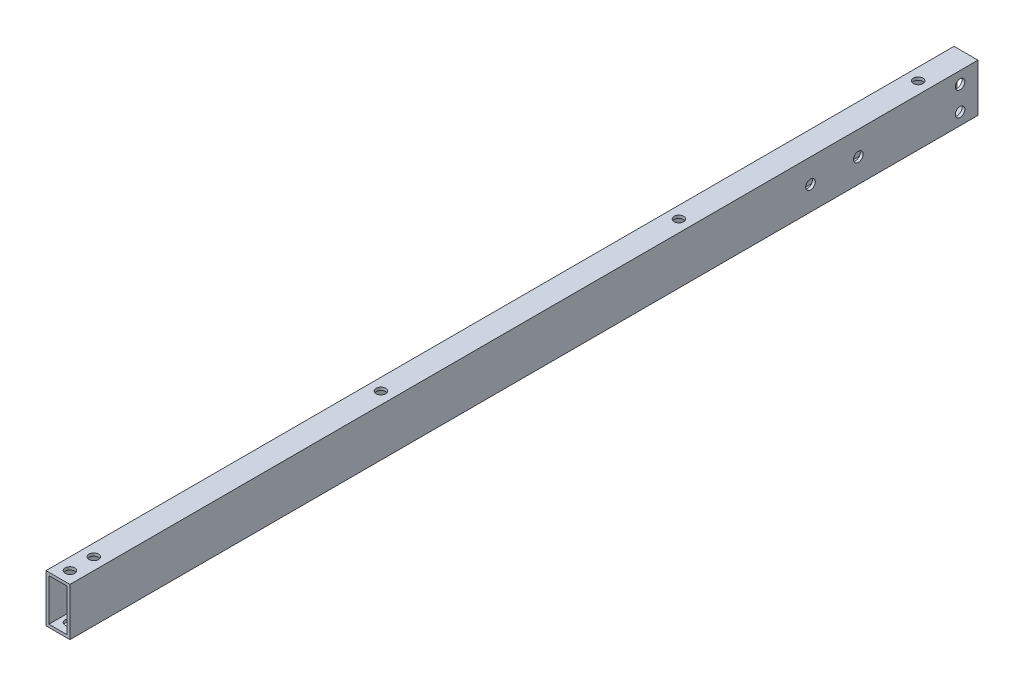
ISO-10303-21;
HEADER;
FILE_DESCRIPTION(('STEP AP214'),'2;1');
FILE_NAME('part.step','',(''),(''),'','','');
FILE_SCHEMA(('AUTOMOTIVE_DESIGN { 1 0 10303 214 1 1 1 1 }'));
ENDSEC;
DATA;
#1=APPLICATION_CONTEXT('core data for automotive mechanical design processes');
#2=APPLICATION_PROTOCOL_DEFINITION('international standard','automotive_design',2000,#1);
#3=PRODUCT_CONTEXT('',#1,'mechanical');
#4=PRODUCT('Part','Part','',(#3));
#5=PRODUCT_RELATED_PRODUCT_CATEGORY('part','',(#4));
#6=PRODUCT_DEFINITION_FORMATION('','',#4);
#7=PRODUCT_DEFINITION_CONTEXT('part definition',#1,'design');
#8=PRODUCT_DEFINITION('design','',#6,#7);
#9=PRODUCT_DEFINITION_SHAPE('','',#8);
#10=(LENGTH_UNIT() NAMED_UNIT(*) SI_UNIT(.MILLI.,.METRE.));
#11=(NAMED_UNIT(*) PLANE_ANGLE_UNIT() SI_UNIT($,.RADIAN.));
#12=(NAMED_UNIT(*) SI_UNIT($,.STERADIAN.) SOLID_ANGLE_UNIT());
#13=UNCERTAINTY_MEASURE_WITH_UNIT(LENGTH_MEASURE(1.E-05),#10,'distance_accuracy_value','');
#14=(GEOMETRIC_REPRESENTATION_CONTEXT(3) GLOBAL_UNCERTAINTY_ASSIGNED_CONTEXT((#13)) GLOBAL_UNIT_ASSIGNED_CONTEXT((#10,
#11,#12)) REPRESENTATION_CONTEXT('',''));
#15=CARTESIAN_POINT('',(0.,0.,0.));
#16=DIRECTION('',(0.,0.,1.));
#17=DIRECTION('',(1.,0.,0.));
#18=AXIS2_PLACEMENT_3D('',#15,#16,#17);
#19=CARTESIAN_POINT('',(0.,0.,379.5));
#20=DIRECTION('',(0.,0.,1.));
#21=DIRECTION('',(1.,0.,0.));
#22=AXIS2_PLACEMENT_3D('',#19,#20,#21);
#23=PLANE('',#22);
#24=DIRECTION('',(0.,1.,0.));
#25=VECTOR('',#24,1.);
#26=CARTESIAN_POINT('',(5.,9.99999999999999,379.5));
#27=LINE('',#26,#25);
#28=CARTESIAN_POINT('',(5.,-10.,379.5));
#29=VERTEX_POINT('',#28);
#30=CARTESIAN_POINT('',(5.,9.99999999999999,379.5));
#31=VERTEX_POINT('',#30);
#32=EDGE_CURVE('E181',#29,#31,#27,.T.);
#33=ORIENTED_EDGE('',*,*,#32,.T.);
#34=DIRECTION('',(-1.,0.,0.));
#35=VECTOR('',#34,1.);
#36=CARTESIAN_POINT('',(-5.,9.99999999999999,379.5));
#37=LINE('',#36,#35);
#38=CARTESIAN_POINT('',(-5.,9.99999999999999,379.5));
#39=VERTEX_POINT('',#38);
#40=EDGE_CURVE('E185',#31,#39,#37,.T.);
#41=ORIENTED_EDGE('',*,*,#40,.T.);
#42=DIRECTION('',(0.,-1.,0.));
#43=VECTOR('',#42,1.);
#44=CARTESIAN_POINT('',(-5.,9.99999999999999,379.5));
#45=LINE('',#44,#43);
#46=CARTESIAN_POINT('',(-5.,-10.,379.5));
#47=VERTEX_POINT('',#46);
#48=EDGE_CURVE('E189',#39,#47,#45,.T.);
#49=ORIENTED_EDGE('',*,*,#48,.T.);
#50=DIRECTION('',(1.,0.,0.));
#51=VECTOR('',#50,1.);
#52=CARTESIAN_POINT('',(-5.,-10.,379.5));
#53=LINE('',#52,#51);
#54=EDGE_CURVE('E192',#47,#29,#53,.T.);
#55=ORIENTED_EDGE('',*,*,#54,.T.);
#56=EDGE_LOOP('',(#33,#41,#49,#55));
#57=FACE_BOUND('',#56,.T.);
#58=DIRECTION('',(-1.,0.,0.));
#59=VECTOR('',#58,1.);
#60=CARTESIAN_POINT('',(-5.,8.79999999999999,379.5));
#61=LINE('',#60,#59);
#62=CARTESIAN_POINT('',(3.8,8.79999999999999,379.5));
#63=VERTEX_POINT('',#62);
#64=CARTESIAN_POINT('',(-3.8,8.79999999999999,379.5));
#65=VERTEX_POINT('',#64);
#66=EDGE_CURVE('E140',#63,#65,#61,.T.);
#67=ORIENTED_EDGE('',*,*,#66,.F.);
#68=DIRECTION('',(0.,1.,0.));
#69=VECTOR('',#68,1.);
#70=CARTESIAN_POINT('',(3.8,9.99999999999999,379.5));
#71=LINE('',#70,#69);
#72=CARTESIAN_POINT('',(3.8,-8.80000000000001,379.5));
#73=VERTEX_POINT('',#72);
#74=EDGE_CURVE('E131',#73,#63,#71,.T.);
#75=ORIENTED_EDGE('',*,*,#74,.F.);
#76=DIRECTION('',(1.,0.,0.));
#77=VECTOR('',#76,1.);
#78=CARTESIAN_POINT('',(-5.,-8.80000000000001,379.5));
#79=LINE('',#78,#77);
#80=CARTESIAN_POINT('',(-3.8,-8.80000000000001,379.5));
#81=VERTEX_POINT('',#80);
#82=EDGE_CURVE('E157',#81,#73,#79,.T.);
#83=ORIENTED_EDGE('',*,*,#82,.F.);
#84=DIRECTION('',(0.,-1.,0.));
#85=VECTOR('',#84,1.);
#86=CARTESIAN_POINT('',(-3.8,9.99999999999999,379.5));
#87=LINE('',#86,#85);
#88=EDGE_CURVE('E153',#65,#81,#87,.T.);
#89=ORIENTED_EDGE('',*,*,#88,.F.);
#90=EDGE_LOOP('',(#67,#75,#83,#89));
#91=FACE_BOUND('',#90,.T.);
#92=ADVANCED_FACE('F63',(#57,#91),#23,.T.);
#93=CARTESIAN_POINT('',(0.,0.,0.));
#94=DIRECTION('',(0.,0.,1.));
#95=DIRECTION('',(1.,0.,0.));
#96=AXIS2_PLACEMENT_3D('',#93,#94,#95);
#97=PLANE('',#96);
#98=DIRECTION('',(0.,1.,0.));
#99=VECTOR('',#98,1.);
#100=CARTESIAN_POINT('',(5.,9.99999999999999,0.));
#101=LINE('',#100,#99);
#102=CARTESIAN_POINT('',(5.,-10.,0.));
#103=VERTEX_POINT('',#102);
#104=CARTESIAN_POINT('',(5.,9.99999999999999,0.));
#105=VERTEX_POINT('',#104);
#106=EDGE_CURVE('E149',#103,#105,#101,.T.);
#107=ORIENTED_EDGE('',*,*,#106,.F.);
#108=DIRECTION('',(1.,0.,0.));
#109=VECTOR('',#108,1.);
#110=CARTESIAN_POINT('',(-5.,-10.,0.));
#111=LINE('',#110,#109);
#112=CARTESIAN_POINT('',(-5.,-10.,0.));
#113=VERTEX_POINT('',#112);
#114=EDGE_CURVE('E186',#113,#103,#111,.T.);
#115=ORIENTED_EDGE('',*,*,#114,.F.);
#116=DIRECTION('',(0.,-1.,0.));
#117=VECTOR('',#116,1.);
#118=CARTESIAN_POINT('',(-5.,9.99999999999999,0.));
#119=LINE('',#118,#117);
#120=CARTESIAN_POINT('',(-5.,9.99999999999999,0.));
#121=VERTEX_POINT('',#120);
#122=EDGE_CURVE('E202',#121,#113,#119,.T.);
#123=ORIENTED_EDGE('',*,*,#122,.F.);
#124=DIRECTION('',(-1.,0.,0.));
#125=VECTOR('',#124,1.);
#126=CARTESIAN_POINT('',(-5.,9.99999999999999,0.));
#127=LINE('',#126,#125);
#128=EDGE_CURVE('E199',#105,#121,#127,.T.);
#129=ORIENTED_EDGE('',*,*,#128,.F.);
#130=EDGE_LOOP('',(#107,#115,#123,#129));
#131=FACE_BOUND('',#130,.T.);
#132=DIRECTION('',(0.,1.,0.));
#133=VECTOR('',#132,1.);
#134=CARTESIAN_POINT('',(3.8,9.99999999999999,0.));
#135=LINE('',#134,#133);
#136=CARTESIAN_POINT('',(3.8,-8.80000000000001,0.));
#137=VERTEX_POINT('',#136);
#138=CARTESIAN_POINT('',(3.8,8.79999999999999,0.));
#139=VERTEX_POINT('',#138);
#140=EDGE_CURVE('E89',#137,#139,#135,.T.);
#141=ORIENTED_EDGE('',*,*,#140,.T.);
#142=DIRECTION('',(-1.,0.,0.));
#143=VECTOR('',#142,1.);
#144=CARTESIAN_POINT('',(-5.,8.79999999999999,0.));
#145=LINE('',#144,#143);
#146=CARTESIAN_POINT('',(-3.8,8.79999999999999,0.));
#147=VERTEX_POINT('',#146);
#148=EDGE_CURVE('E147',#139,#147,#145,.T.);
#149=ORIENTED_EDGE('',*,*,#148,.T.);
#150=DIRECTION('',(0.,-1.,0.));
#151=VECTOR('',#150,1.);
#152=CARTESIAN_POINT('',(-3.8,9.99999999999999,0.));
#153=LINE('',#152,#151);
#154=CARTESIAN_POINT('',(-3.8,-8.80000000000001,0.));
#155=VERTEX_POINT('',#154);
#156=EDGE_CURVE('E168',#147,#155,#153,.T.);
#157=ORIENTED_EDGE('',*,*,#156,.T.);
#158=DIRECTION('',(1.,0.,0.));
#159=VECTOR('',#158,1.);
#160=CARTESIAN_POINT('',(-5.,-8.80000000000001,0.));
#161=LINE('',#160,#159);
#162=EDGE_CURVE('E141',#155,#137,#161,.T.);
#163=ORIENTED_EDGE('',*,*,#162,.T.);
#164=EDGE_LOOP('',(#141,#149,#157,#163));
#165=FACE_BOUND('',#164,.T.);
#166=ADVANCED_FACE('F365',(#131,#165),#97,.F.);
#167=CARTESIAN_POINT('',(5.,9.99999999999999,379.5));
#168=DIRECTION('',(-1.,0.,0.));
#169=DIRECTION('',(0.,-1.,0.));
#170=AXIS2_PLACEMENT_3D('',#167,#168,#169);
#171=PLANE('',#170);
#172=CARTESIAN_POINT('',(5.,0.,70.));
#173=DIRECTION('',(1.,0.,0.));
#174=DIRECTION('',(0.,1.,0.));
#175=AXIS2_PLACEMENT_3D('',#172,#173,#174);
#176=CIRCLE('',#175,2.);
#177=CARTESIAN_POINT('',(5.,1.99999999999999,70.));
#178=VERTEX_POINT('',#177);
#179=EDGE_CURVE('E422',#178,#178,#176,.T.);
#180=ORIENTED_EDGE('',*,*,#179,.F.);
#181=EDGE_LOOP('',(#180));
#182=FACE_BOUND('',#181,.T.);
#183=CARTESIAN_POINT('',(5.,0.,50.));
#184=DIRECTION('',(1.,0.,0.));
#185=DIRECTION('',(0.,1.,0.));
#186=AXIS2_PLACEMENT_3D('',#183,#184,#185);
#187=CIRCLE('',#186,2.);
#188=CARTESIAN_POINT('',(5.,2.,50.));
#189=VERTEX_POINT('',#188);
#190=EDGE_CURVE('E416',#189,#189,#187,.T.);
#191=ORIENTED_EDGE('',*,*,#190,.F.);
#192=EDGE_LOOP('',(#191));
#193=FACE_BOUND('',#192,.T.);
#194=CARTESIAN_POINT('',(5.,5.,7.5));
#195=DIRECTION('',(1.,0.,0.));
#196=DIRECTION('',(0.,1.,0.));
#197=AXIS2_PLACEMENT_3D('',#194,#195,#196);
#198=CIRCLE('',#197,2.);
#199=CARTESIAN_POINT('',(5.,7.,7.5));
#200=VERTEX_POINT('',#199);
#201=EDGE_CURVE('E405',#200,#200,#198,.T.);
#202=ORIENTED_EDGE('',*,*,#201,.F.);
#203=EDGE_LOOP('',(#202));
#204=FACE_BOUND('',#203,.T.);
#205=CARTESIAN_POINT('',(5.,-5.,7.5));
#206=DIRECTION('',(1.,0.,0.));
#207=DIRECTION('',(0.,-1.,0.));
#208=AXIS2_PLACEMENT_3D('',#205,#206,#207);
#209=CIRCLE('',#208,2.);
#210=CARTESIAN_POINT('',(5.,-7.,7.5));
#211=VERTEX_POINT('',#210);
#212=EDGE_CURVE('E406',#211,#211,#209,.T.);
#213=ORIENTED_EDGE('',*,*,#212,.F.);
#214=EDGE_LOOP('',(#213));
#215=FACE_BOUND('',#214,.T.);
#216=ORIENTED_EDGE('',*,*,#106,.T.);
#217=DIRECTION('',(0.,0.,-1.));
#218=VECTOR('',#217,1.);
#219=CARTESIAN_POINT('',(5.,9.99999999999999,379.5));
#220=LINE('',#219,#218);
#221=EDGE_CURVE('E12',#31,#105,#220,.T.);
#222=ORIENTED_EDGE('',*,*,#221,.F.);
#223=ORIENTED_EDGE('',*,*,#32,.F.);
#224=DIRECTION('',(0.,0.,-1.));
#225=VECTOR('',#224,1.);
#226=CARTESIAN_POINT('',(5.,-10.,379.5));
#227=LINE('',#226,#225);
#228=EDGE_CURVE('E195',#29,#103,#227,.T.);
#229=ORIENTED_EDGE('',*,*,#228,.T.);
#230=EDGE_LOOP('',(#216,#222,#223,#229));
#231=FACE_BOUND('',#230,.T.);
#232=ADVANCED_FACE('F65',(#182,#193,#204,#215,#231),#171,.F.);
#233=CARTESIAN_POINT('',(-5.,9.99999999999999,379.5));
#234=DIRECTION('',(0.,-1.,0.));
#235=DIRECTION('',(0.,0.,-1.));
#236=AXIS2_PLACEMENT_3D('',#233,#234,#235);
#237=PLANE('',#236);
#238=CARTESIAN_POINT('',(0.,9.99999999999999,20.));
#239=DIRECTION('',(0.,1.,0.));
#240=DIRECTION('',(0.,0.,1.));
#241=AXIS2_PLACEMENT_3D('',#238,#239,#240);
#242=CIRCLE('',#241,2.);
#243=CARTESIAN_POINT('',(0.,9.99999999999999,22.));
#244=VERTEX_POINT('',#243);
#245=EDGE_CURVE('E273',#244,#244,#242,.T.);
#246=ORIENTED_EDGE('',*,*,#245,.F.);
#247=EDGE_LOOP('',(#246));
#248=FACE_BOUND('',#247,.T.);
#249=CARTESIAN_POINT('',(0.,9.99999999999999,120.));
#250=DIRECTION('',(0.,1.,0.));
#251=DIRECTION('',(0.,0.,1.));
#252=AXIS2_PLACEMENT_3D('',#249,#250,#251);
#253=CIRCLE('',#252,2.);
#254=CARTESIAN_POINT('',(0.,9.99999999999999,122.));
#255=VERTEX_POINT('',#254);
#256=EDGE_CURVE('E295',#255,#255,#253,.T.);
#257=ORIENTED_EDGE('',*,*,#256,.F.);
#258=EDGE_LOOP('',(#257));
#259=FACE_BOUND('',#258,.T.);
#260=CARTESIAN_POINT('',(0.,9.99999999999999,244.5));
#261=DIRECTION('',(0.,1.,0.));
#262=DIRECTION('',(0.,0.,1.));
#263=AXIS2_PLACEMENT_3D('',#260,#261,#262);
#264=CIRCLE('',#263,2.);
#265=CARTESIAN_POINT('',(0.,9.99999999999999,246.5));
#266=VERTEX_POINT('',#265);
#267=EDGE_CURVE('E287',#266,#266,#264,.T.);
#268=ORIENTED_EDGE('',*,*,#267,.F.);
#269=EDGE_LOOP('',(#268));
#270=FACE_BOUND('',#269,.T.);
#271=CARTESIAN_POINT('',(0.,9.99999999999999,374.5));
#272=DIRECTION('',(0.,1.,0.));
#273=DIRECTION('',(0.,0.,1.));
#274=AXIS2_PLACEMENT_3D('',#271,#272,#273);
#275=CIRCLE('',#274,2.);
#276=CARTESIAN_POINT('',(0.,9.99999999999999,376.5));
#277=VERTEX_POINT('',#276);
#278=EDGE_CURVE('E279',#277,#277,#275,.T.);
#279=ORIENTED_EDGE('',*,*,#278,.F.);
#280=EDGE_LOOP('',(#279));
#281=FACE_BOUND('',#280,.T.);
#282=CARTESIAN_POINT('',(0.,9.99999999999999,364.5));
#283=DIRECTION('',(0.,1.,0.));
#284=DIRECTION('',(0.,0.,1.));
#285=AXIS2_PLACEMENT_3D('',#282,#283,#284);
#286=CIRCLE('',#285,2.);
#287=CARTESIAN_POINT('',(0.,9.99999999999999,366.5));
#288=VERTEX_POINT('',#287);
#289=EDGE_CURVE('E278',#288,#288,#286,.T.);
#290=ORIENTED_EDGE('',*,*,#289,.F.);
#291=EDGE_LOOP('',(#290));
#292=FACE_BOUND('',#291,.T.);
#293=ORIENTED_EDGE('',*,*,#128,.T.);
#294=DIRECTION('',(0.,0.,-1.));
#295=VECTOR('',#294,1.);
#296=CARTESIAN_POINT('',(-5.,9.99999999999999,379.5));
#297=LINE('',#296,#295);
#298=EDGE_CURVE('E73',#39,#121,#297,.T.);
#299=ORIENTED_EDGE('',*,*,#298,.F.);
#300=ORIENTED_EDGE('',*,*,#40,.F.);
#301=ORIENTED_EDGE('',*,*,#221,.T.);
#302=EDGE_LOOP('',(#293,#299,#300,#301));
#303=FACE_BOUND('',#302,.T.);
#304=ADVANCED_FACE('F351',(#248,#259,#270,#281,#292,#303),#237,.F.);
#305=CARTESIAN_POINT('',(-5.,9.99999999999999,379.5));
#306=DIRECTION('',(1.,0.,0.));
#307=DIRECTION('',(0.,1.,0.));
#308=AXIS2_PLACEMENT_3D('',#305,#306,#307);
#309=PLANE('',#308);
#310=CARTESIAN_POINT('',(-5.,0.,70.));
#311=DIRECTION('',(1.,0.,0.));
#312=DIRECTION('',(0.,1.,0.));
#313=AXIS2_PLACEMENT_3D('',#310,#311,#312);
#314=CIRCLE('',#313,2.);
#315=CARTESIAN_POINT('',(-5.,1.99999999999999,70.));
#316=VERTEX_POINT('',#315);
#317=EDGE_CURVE('E247',#316,#316,#314,.T.);
#318=ORIENTED_EDGE('',*,*,#317,.T.);
#319=EDGE_LOOP('',(#318));
#320=FACE_BOUND('',#319,.T.);
#321=CARTESIAN_POINT('',(-5.,0.,50.));
#322=DIRECTION('',(1.,0.,0.));
#323=DIRECTION('',(0.,1.,0.));
#324=AXIS2_PLACEMENT_3D('',#321,#322,#323);
#325=CIRCLE('',#324,2.);
#326=CARTESIAN_POINT('',(-5.,2.,50.));
#327=VERTEX_POINT('',#326);
#328=EDGE_CURVE('E395',#327,#327,#325,.T.);
#329=ORIENTED_EDGE('',*,*,#328,.T.);
#330=EDGE_LOOP('',(#329));
#331=FACE_BOUND('',#330,.T.);
#332=CARTESIAN_POINT('',(-5.,5.,7.5));
#333=DIRECTION('',(1.,0.,0.));
#334=DIRECTION('',(0.,1.,0.));
#335=AXIS2_PLACEMENT_3D('',#332,#333,#334);
#336=CIRCLE('',#335,2.);
#337=CARTESIAN_POINT('',(-5.,7.,7.5));
#338=VERTEX_POINT('',#337);
#339=EDGE_CURVE('E399',#338,#338,#336,.T.);
#340=ORIENTED_EDGE('',*,*,#339,.T.);
#341=EDGE_LOOP('',(#340));
#342=FACE_BOUND('',#341,.T.);
#343=CARTESIAN_POINT('',(-5.,-5.,7.5));
#344=DIRECTION('',(1.,0.,0.));
#345=DIRECTION('',(0.,-1.,0.));
#346=AXIS2_PLACEMENT_3D('',#343,#344,#345);
#347=CIRCLE('',#346,2.);
#348=CARTESIAN_POINT('',(-5.,-7.,7.5));
#349=VERTEX_POINT('',#348);
#350=EDGE_CURVE('E402',#349,#349,#347,.T.);
#351=ORIENTED_EDGE('',*,*,#350,.T.);
#352=EDGE_LOOP('',(#351));
#353=FACE_BOUND('',#352,.T.);
#354=ORIENTED_EDGE('',*,*,#122,.T.);
#355=DIRECTION('',(0.,0.,-1.));
#356=VECTOR('',#355,1.);
#357=CARTESIAN_POINT('',(-5.,-10.,379.5));
#358=LINE('',#357,#356);
#359=EDGE_CURVE('E210',#47,#113,#358,.T.);
#360=ORIENTED_EDGE('',*,*,#359,.F.);
#361=ORIENTED_EDGE('',*,*,#48,.F.);
#362=ORIENTED_EDGE('',*,*,#298,.T.);
#363=EDGE_LOOP('',(#354,#360,#361,#362));
#364=FACE_BOUND('',#363,.T.);
#365=ADVANCED_FACE('F354',(#320,#331,#342,#353,#364),#309,.F.);
#366=CARTESIAN_POINT('',(-5.,-10.,379.5));
#367=DIRECTION('',(0.,1.,0.));
#368=DIRECTION('',(0.,0.,1.));
#369=AXIS2_PLACEMENT_3D('',#366,#367,#368);
#370=PLANE('',#369);
#371=CARTESIAN_POINT('',(0.,-10.,20.));
#372=DIRECTION('',(0.,1.,0.));
#373=DIRECTION('',(0.,0.,1.));
#374=AXIS2_PLACEMENT_3D('',#371,#372,#373);
#375=CIRCLE('',#374,2.);
#376=CARTESIAN_POINT('',(0.,-10.,22.));
#377=VERTEX_POINT('',#376);
#378=EDGE_CURVE('E299',#377,#377,#375,.T.);
#379=ORIENTED_EDGE('',*,*,#378,.T.);
#380=EDGE_LOOP('',(#379));
#381=FACE_BOUND('',#380,.T.);
#382=CARTESIAN_POINT('',(0.,-10.,120.));
#383=DIRECTION('',(0.,1.,0.));
#384=DIRECTION('',(0.,0.,1.));
#385=AXIS2_PLACEMENT_3D('',#382,#383,#384);
#386=CIRCLE('',#385,2.);
#387=CARTESIAN_POINT('',(0.,-10.,122.));
#388=VERTEX_POINT('',#387);
#389=EDGE_CURVE('E291',#388,#388,#386,.T.);
#390=ORIENTED_EDGE('',*,*,#389,.T.);
#391=EDGE_LOOP('',(#390));
#392=FACE_BOUND('',#391,.T.);
#393=CARTESIAN_POINT('',(0.,-10.,244.5));
#394=DIRECTION('',(0.,1.,0.));
#395=DIRECTION('',(0.,0.,1.));
#396=AXIS2_PLACEMENT_3D('',#393,#394,#395);
#397=CIRCLE('',#396,2.);
#398=CARTESIAN_POINT('',(0.,-10.,246.5));
#399=VERTEX_POINT('',#398);
#400=EDGE_CURVE('E283',#399,#399,#397,.T.);
#401=ORIENTED_EDGE('',*,*,#400,.T.);
#402=EDGE_LOOP('',(#401));
#403=FACE_BOUND('',#402,.T.);
#404=CARTESIAN_POINT('',(0.,-10.,374.5));
#405=DIRECTION('',(0.,1.,0.));
#406=DIRECTION('',(0.,0.,1.));
#407=AXIS2_PLACEMENT_3D('',#404,#405,#406);
#408=CIRCLE('',#407,2.);
#409=CARTESIAN_POINT('',(0.,-10.,376.5));
#410=VERTEX_POINT('',#409);
#411=EDGE_CURVE('E274',#410,#410,#408,.T.);
#412=ORIENTED_EDGE('',*,*,#411,.T.);
#413=EDGE_LOOP('',(#412));
#414=FACE_BOUND('',#413,.T.);
#415=CARTESIAN_POINT('',(0.,-10.,364.5));
#416=DIRECTION('',(0.,1.,0.));
#417=DIRECTION('',(0.,0.,1.));
#418=AXIS2_PLACEMENT_3D('',#415,#416,#417);
#419=CIRCLE('',#418,2.);
#420=CARTESIAN_POINT('',(0.,-10.,366.5));
#421=VERTEX_POINT('',#420);
#422=EDGE_CURVE('E222',#421,#421,#419,.T.);
#423=ORIENTED_EDGE('',*,*,#422,.T.);
#424=EDGE_LOOP('',(#423));
#425=FACE_BOUND('',#424,.T.);
#426=ORIENTED_EDGE('',*,*,#114,.T.);
#427=ORIENTED_EDGE('',*,*,#228,.F.);
#428=ORIENTED_EDGE('',*,*,#54,.F.);
#429=ORIENTED_EDGE('',*,*,#359,.T.);
#430=EDGE_LOOP('',(#426,#427,#428,#429));
#431=FACE_BOUND('',#430,.T.);
#432=ADVANCED_FACE('F369',(#381,#392,#403,#414,#425,#431),#370,.F.);
#433=CARTESIAN_POINT('',(3.8,9.99999999999999,379.5));
#434=DIRECTION('',(-1.,0.,0.));
#435=DIRECTION('',(0.,-1.,0.));
#436=AXIS2_PLACEMENT_3D('',#433,#434,#435);
#437=PLANE('',#436);
#438=CARTESIAN_POINT('',(3.8,0.,70.));
#439=DIRECTION('',(-1.,0.,0.));
#440=DIRECTION('',(0.,-1.,0.));
#441=AXIS2_PLACEMENT_3D('',#438,#439,#440);
#442=CIRCLE('',#441,2.);
#443=CARTESIAN_POINT('',(3.8,-2.,70.));
#444=VERTEX_POINT('',#443);
#445=EDGE_CURVE('E269',#444,#444,#442,.T.);
#446=ORIENTED_EDGE('',*,*,#445,.F.);
#447=EDGE_LOOP('',(#446));
#448=FACE_BOUND('',#447,.T.);
#449=CARTESIAN_POINT('',(3.8,0.,50.));
#450=DIRECTION('',(-1.,0.,0.));
#451=DIRECTION('',(0.,-1.,0.));
#452=AXIS2_PLACEMENT_3D('',#449,#450,#451);
#453=CIRCLE('',#452,2.);
#454=CARTESIAN_POINT('',(3.8,-2.00000000000001,50.));
#455=VERTEX_POINT('',#454);
#456=EDGE_CURVE('E255',#455,#455,#453,.T.);
#457=ORIENTED_EDGE('',*,*,#456,.F.);
#458=EDGE_LOOP('',(#457));
#459=FACE_BOUND('',#458,.T.);
#460=CARTESIAN_POINT('',(3.8,5.,7.5));
#461=DIRECTION('',(-1.,0.,0.));
#462=DIRECTION('',(0.,-1.,0.));
#463=AXIS2_PLACEMENT_3D('',#460,#461,#462);
#464=CIRCLE('',#463,2.);
#465=CARTESIAN_POINT('',(3.8,3.,7.5));
#466=VERTEX_POINT('',#465);
#467=EDGE_CURVE('E251',#466,#466,#464,.T.);
#468=ORIENTED_EDGE('',*,*,#467,.F.);
#469=EDGE_LOOP('',(#468));
#470=FACE_BOUND('',#469,.T.);
#471=CARTESIAN_POINT('',(3.8,-5.,7.5));
#472=DIRECTION('',(-1.,0.,0.));
#473=DIRECTION('',(0.,-1.,0.));
#474=AXIS2_PLACEMENT_3D('',#471,#472,#473);
#475=CIRCLE('',#474,2.);
#476=CARTESIAN_POINT('',(3.8,-7.,7.5));
#477=VERTEX_POINT('',#476);
#478=EDGE_CURVE('E246',#477,#477,#475,.T.);
#479=ORIENTED_EDGE('',*,*,#478,.F.);
#480=EDGE_LOOP('',(#479));
#481=FACE_BOUND('',#480,.T.);
#482=ORIENTED_EDGE('',*,*,#140,.F.);
#483=DIRECTION('',(0.,0.,-1.));
#484=VECTOR('',#483,1.);
#485=CARTESIAN_POINT('',(3.8,-8.80000000000001,379.5));
#486=LINE('',#485,#484);
#487=EDGE_CURVE('E135',#73,#137,#486,.T.);
#488=ORIENTED_EDGE('',*,*,#487,.F.);
#489=ORIENTED_EDGE('',*,*,#74,.T.);
#490=DIRECTION('',(0.,0.,-1.));
#491=VECTOR('',#490,1.);
#492=CARTESIAN_POINT('',(3.8,8.79999999999999,379.5));
#493=LINE('',#492,#491);
#494=EDGE_CURVE('E134',#63,#139,#493,.T.);
#495=ORIENTED_EDGE('',*,*,#494,.T.);
#496=EDGE_LOOP('',(#482,#488,#489,#495));
#497=FACE_BOUND('',#496,.T.);
#498=ADVANCED_FACE('F133',(#448,#459,#470,#481,#497),#437,.T.);
#499=CARTESIAN_POINT('',(-5.,8.79999999999999,379.5));
#500=DIRECTION('',(0.,-1.,0.));
#501=DIRECTION('',(0.,0.,-1.));
#502=AXIS2_PLACEMENT_3D('',#499,#500,#501);
#503=PLANE('',#502);
#504=CARTESIAN_POINT('',(0.,8.79999999999999,20.));
#505=DIRECTION('',(0.,-1.,0.));
#506=DIRECTION('',(0.,0.,-1.));
#507=AXIS2_PLACEMENT_3D('',#504,#505,#506);
#508=CIRCLE('',#507,2.);
#509=CARTESIAN_POINT('',(0.,8.79999999999999,18.));
#510=VERTEX_POINT('',#509);
#511=EDGE_CURVE('E165',#510,#510,#508,.T.);
#512=ORIENTED_EDGE('',*,*,#511,.F.);
#513=EDGE_LOOP('',(#512));
#514=FACE_BOUND('',#513,.T.);
#515=CARTESIAN_POINT('',(0.,8.79999999999999,120.));
#516=DIRECTION('',(0.,-1.,0.));
#517=DIRECTION('',(0.,0.,-1.));
#518=AXIS2_PLACEMENT_3D('',#515,#516,#517);
#519=CIRCLE('',#518,2.);
#520=CARTESIAN_POINT('',(0.,8.79999999999999,118.));
#521=VERTEX_POINT('',#520);
#522=EDGE_CURVE('E237',#521,#521,#519,.T.);
#523=ORIENTED_EDGE('',*,*,#522,.F.);
#524=EDGE_LOOP('',(#523));
#525=FACE_BOUND('',#524,.T.);
#526=CARTESIAN_POINT('',(0.,8.79999999999999,244.5));
#527=DIRECTION('',(0.,-1.,0.));
#528=DIRECTION('',(0.,0.,-1.));
#529=AXIS2_PLACEMENT_3D('',#526,#527,#528);
#530=CIRCLE('',#529,2.);
#531=CARTESIAN_POINT('',(0.,8.79999999999999,242.5));
#532=VERTEX_POINT('',#531);
#533=EDGE_CURVE('E232',#532,#532,#530,.T.);
#534=ORIENTED_EDGE('',*,*,#533,.F.);
#535=EDGE_LOOP('',(#534));
#536=FACE_BOUND('',#535,.T.);
#537=CARTESIAN_POINT('',(0.,8.79999999999999,374.5));
#538=DIRECTION('',(0.,-1.,0.));
#539=DIRECTION('',(0.,0.,-1.));
#540=AXIS2_PLACEMENT_3D('',#537,#538,#539);
#541=CIRCLE('',#540,2.);
#542=CARTESIAN_POINT('',(0.,8.79999999999999,372.5));
#543=VERTEX_POINT('',#542);
#544=EDGE_CURVE('E227',#543,#543,#541,.T.);
#545=ORIENTED_EDGE('',*,*,#544,.F.);
#546=EDGE_LOOP('',(#545));
#547=FACE_BOUND('',#546,.T.);
#548=CARTESIAN_POINT('',(0.,8.79999999999999,364.5));
#549=DIRECTION('',(0.,-1.,0.));
#550=DIRECTION('',(0.,0.,-1.));
#551=AXIS2_PLACEMENT_3D('',#548,#549,#550);
#552=CIRCLE('',#551,2.);
#553=CARTESIAN_POINT('',(0.,8.79999999999999,362.5));
#554=VERTEX_POINT('',#553);
#555=EDGE_CURVE('E221',#554,#554,#552,.T.);
#556=ORIENTED_EDGE('',*,*,#555,.F.);
#557=EDGE_LOOP('',(#556));
#558=FACE_BOUND('',#557,.T.);
#559=ORIENTED_EDGE('',*,*,#148,.F.);
#560=ORIENTED_EDGE('',*,*,#494,.F.);
#561=ORIENTED_EDGE('',*,*,#66,.T.);
#562=DIRECTION('',(0.,0.,-1.));
#563=VECTOR('',#562,1.);
#564=CARTESIAN_POINT('',(-3.8,8.79999999999999,379.5));
#565=LINE('',#564,#563);
#566=EDGE_CURVE('E150',#65,#147,#565,.T.);
#567=ORIENTED_EDGE('',*,*,#566,.T.);
#568=EDGE_LOOP('',(#559,#560,#561,#567));
#569=FACE_BOUND('',#568,.T.);
#570=ADVANCED_FACE('F144',(#514,#525,#536,#547,#558,#569),#503,.T.);
#571=CARTESIAN_POINT('',(-3.8,9.99999999999999,379.5));
#572=DIRECTION('',(1.,0.,0.));
#573=DIRECTION('',(0.,1.,0.));
#574=AXIS2_PLACEMENT_3D('',#571,#572,#573);
#575=PLANE('',#574);
#576=CARTESIAN_POINT('',(-3.8,0.,70.));
#577=DIRECTION('',(1.,0.,0.));
#578=DIRECTION('',(0.,1.,0.));
#579=AXIS2_PLACEMENT_3D('',#576,#577,#578);
#580=CIRCLE('',#579,2.);
#581=CARTESIAN_POINT('',(-3.8,1.99999999999999,70.));
#582=VERTEX_POINT('',#581);
#583=EDGE_CURVE('E67',#582,#582,#580,.T.);
#584=ORIENTED_EDGE('',*,*,#583,.F.);
#585=EDGE_LOOP('',(#584));
#586=FACE_BOUND('',#585,.T.);
#587=CARTESIAN_POINT('',(-3.8,0.,50.));
#588=DIRECTION('',(1.,0.,0.));
#589=DIRECTION('',(0.,1.,0.));
#590=AXIS2_PLACEMENT_3D('',#587,#588,#589);
#591=CIRCLE('',#590,2.);
#592=CARTESIAN_POINT('',(-3.8,2.,50.));
#593=VERTEX_POINT('',#592);
#594=EDGE_CURVE('E252',#593,#593,#591,.T.);
#595=ORIENTED_EDGE('',*,*,#594,.F.);
#596=EDGE_LOOP('',(#595));
#597=FACE_BOUND('',#596,.T.);
#598=CARTESIAN_POINT('',(-3.8,5.,7.5));
#599=DIRECTION('',(1.,0.,0.));
#600=DIRECTION('',(0.,1.,0.));
#601=AXIS2_PLACEMENT_3D('',#598,#599,#600);
#602=CIRCLE('',#601,2.);
#603=CARTESIAN_POINT('',(-3.8,7.,7.5));
#604=VERTEX_POINT('',#603);
#605=EDGE_CURVE('E248',#604,#604,#602,.T.);
#606=ORIENTED_EDGE('',*,*,#605,.F.);
#607=EDGE_LOOP('',(#606));
#608=FACE_BOUND('',#607,.T.);
#609=CARTESIAN_POINT('',(-3.8,-5.,7.5));
#610=DIRECTION('',(1.,0.,0.));
#611=DIRECTION('',(0.,1.,0.));
#612=AXIS2_PLACEMENT_3D('',#609,#610,#611);
#613=CIRCLE('',#612,2.);
#614=CARTESIAN_POINT('',(-3.8,-3.,7.5));
#615=VERTEX_POINT('',#614);
#616=EDGE_CURVE('E242',#615,#615,#613,.T.);
#617=ORIENTED_EDGE('',*,*,#616,.F.);
#618=EDGE_LOOP('',(#617));
#619=FACE_BOUND('',#618,.T.);
#620=ORIENTED_EDGE('',*,*,#156,.F.);
#621=ORIENTED_EDGE('',*,*,#566,.F.);
#622=ORIENTED_EDGE('',*,*,#88,.T.);
#623=DIRECTION('',(0.,0.,-1.));
#624=VECTOR('',#623,1.);
#625=CARTESIAN_POINT('',(-3.8,-8.80000000000001,379.5));
#626=LINE('',#625,#624);
#627=EDGE_CURVE('E81',#81,#155,#626,.T.);
#628=ORIENTED_EDGE('',*,*,#627,.T.);
#629=EDGE_LOOP('',(#620,#621,#622,#628));
#630=FACE_BOUND('',#629,.T.);
#631=ADVANCED_FACE('F332',(#586,#597,#608,#619,#630),#575,.T.);
#632=CARTESIAN_POINT('',(-5.,-8.80000000000001,379.5));
#633=DIRECTION('',(0.,1.,0.));
#634=DIRECTION('',(0.,0.,1.));
#635=AXIS2_PLACEMENT_3D('',#632,#633,#634);
#636=PLANE('',#635);
#637=CARTESIAN_POINT('',(0.,-8.80000000000001,20.));
#638=DIRECTION('',(0.,1.,0.));
#639=DIRECTION('',(0.,0.,1.));
#640=AXIS2_PLACEMENT_3D('',#637,#638,#639);
#641=CIRCLE('',#640,2.);
#642=CARTESIAN_POINT('',(0.,-8.80000000000001,22.));
#643=VERTEX_POINT('',#642);
#644=EDGE_CURVE('E238',#643,#643,#641,.T.);
#645=ORIENTED_EDGE('',*,*,#644,.F.);
#646=EDGE_LOOP('',(#645));
#647=FACE_BOUND('',#646,.T.);
#648=CARTESIAN_POINT('',(0.,-8.80000000000001,120.));
#649=DIRECTION('',(0.,1.,0.));
#650=DIRECTION('',(0.,0.,1.));
#651=AXIS2_PLACEMENT_3D('',#648,#649,#650);
#652=CIRCLE('',#651,2.);
#653=CARTESIAN_POINT('',(0.,-8.80000000000001,122.));
#654=VERTEX_POINT('',#653);
#655=EDGE_CURVE('E233',#654,#654,#652,.T.);
#656=ORIENTED_EDGE('',*,*,#655,.F.);
#657=EDGE_LOOP('',(#656));
#658=FACE_BOUND('',#657,.T.);
#659=CARTESIAN_POINT('',(0.,-8.80000000000001,244.5));
#660=DIRECTION('',(0.,1.,0.));
#661=DIRECTION('',(0.,0.,1.));
#662=AXIS2_PLACEMENT_3D('',#659,#660,#661);
#663=CIRCLE('',#662,2.);
#664=CARTESIAN_POINT('',(0.,-8.80000000000001,246.5));
#665=VERTEX_POINT('',#664);
#666=EDGE_CURVE('E228',#665,#665,#663,.T.);
#667=ORIENTED_EDGE('',*,*,#666,.F.);
#668=EDGE_LOOP('',(#667));
#669=FACE_BOUND('',#668,.T.);
#670=CARTESIAN_POINT('',(0.,-8.80000000000001,374.5));
#671=DIRECTION('',(0.,1.,0.));
#672=DIRECTION('',(0.,0.,1.));
#673=AXIS2_PLACEMENT_3D('',#670,#671,#672);
#674=CIRCLE('',#673,2.);
#675=CARTESIAN_POINT('',(0.,-8.80000000000001,376.5));
#676=VERTEX_POINT('',#675);
#677=EDGE_CURVE('E223',#676,#676,#674,.T.);
#678=ORIENTED_EDGE('',*,*,#677,.F.);
#679=EDGE_LOOP('',(#678));
#680=FACE_BOUND('',#679,.T.);
#681=CARTESIAN_POINT('',(0.,-8.80000000000001,364.5));
#682=DIRECTION('',(0.,1.,0.));
#683=DIRECTION('',(0.,0.,1.));
#684=AXIS2_PLACEMENT_3D('',#681,#682,#683);
#685=CIRCLE('',#684,2.);
#686=CARTESIAN_POINT('',(0.,-8.80000000000001,366.5));
#687=VERTEX_POINT('',#686);
#688=EDGE_CURVE('E217',#687,#687,#685,.T.);
#689=ORIENTED_EDGE('',*,*,#688,.F.);
#690=EDGE_LOOP('',(#689));
#691=FACE_BOUND('',#690,.T.);
#692=ORIENTED_EDGE('',*,*,#162,.F.);
#693=ORIENTED_EDGE('',*,*,#627,.F.);
#694=ORIENTED_EDGE('',*,*,#82,.T.);
#695=ORIENTED_EDGE('',*,*,#487,.T.);
#696=EDGE_LOOP('',(#692,#693,#694,#695));
#697=FACE_BOUND('',#696,.T.);
#698=ADVANCED_FACE('F484',(#647,#658,#669,#680,#691,#697),#636,.T.);
#699=CARTESIAN_POINT('',(0.,-10.,364.5));
#700=DIRECTION('',(0.,1.,0.));
#701=DIRECTION('',(0.,0.,1.));
#702=AXIS2_PLACEMENT_3D('',#699,#700,#701);
#703=CYLINDRICAL_SURFACE('',#702,2.);
#704=ORIENTED_EDGE('',*,*,#688,.T.);
#705=EDGE_LOOP('',(#704));
#706=FACE_BOUND('',#705,.T.);
#707=ORIENTED_EDGE('',*,*,#422,.F.);
#708=EDGE_LOOP('',(#707));
#709=FACE_BOUND('',#708,.T.);
#710=ADVANCED_FACE('F348',(#706,#709),#703,.F.);
#711=CARTESIAN_POINT('',(0.,-10.,374.5));
#712=DIRECTION('',(0.,1.,0.));
#713=DIRECTION('',(0.,0.,1.));
#714=AXIS2_PLACEMENT_3D('',#711,#712,#713);
#715=CYLINDRICAL_SURFACE('',#714,2.);
#716=ORIENTED_EDGE('',*,*,#677,.T.);
#717=EDGE_LOOP('',(#716));
#718=FACE_BOUND('',#717,.T.);
#719=ORIENTED_EDGE('',*,*,#411,.F.);
#720=EDGE_LOOP('',(#719));
#721=FACE_BOUND('',#720,.T.);
#722=ADVANCED_FACE('F494',(#718,#721),#715,.F.);
#723=CARTESIAN_POINT('',(0.,-10.,244.5));
#724=DIRECTION('',(0.,1.,0.));
#725=DIRECTION('',(0.,0.,1.));
#726=AXIS2_PLACEMENT_3D('',#723,#724,#725);
#727=CYLINDRICAL_SURFACE('',#726,2.);
#728=ORIENTED_EDGE('',*,*,#666,.T.);
#729=EDGE_LOOP('',(#728));
#730=FACE_BOUND('',#729,.T.);
#731=ORIENTED_EDGE('',*,*,#400,.F.);
#732=EDGE_LOOP('',(#731));
#733=FACE_BOUND('',#732,.T.);
#734=ADVANCED_FACE('F504',(#730,#733),#727,.F.);
#735=CARTESIAN_POINT('',(0.,-10.,120.));
#736=DIRECTION('',(0.,1.,0.));
#737=DIRECTION('',(0.,0.,1.));
#738=AXIS2_PLACEMENT_3D('',#735,#736,#737);
#739=CYLINDRICAL_SURFACE('',#738,2.);
#740=ORIENTED_EDGE('',*,*,#655,.T.);
#741=EDGE_LOOP('',(#740));
#742=FACE_BOUND('',#741,.T.);
#743=ORIENTED_EDGE('',*,*,#389,.F.);
#744=EDGE_LOOP('',(#743));
#745=FACE_BOUND('',#744,.T.);
#746=ADVANCED_FACE('F500',(#742,#745),#739,.F.);
#747=CARTESIAN_POINT('',(0.,-10.,20.));
#748=DIRECTION('',(0.,1.,0.));
#749=DIRECTION('',(0.,0.,1.));
#750=AXIS2_PLACEMENT_3D('',#747,#748,#749);
#751=CYLINDRICAL_SURFACE('',#750,2.);
#752=ORIENTED_EDGE('',*,*,#644,.T.);
#753=EDGE_LOOP('',(#752));
#754=FACE_BOUND('',#753,.T.);
#755=ORIENTED_EDGE('',*,*,#378,.F.);
#756=EDGE_LOOP('',(#755));
#757=FACE_BOUND('',#756,.T.);
#758=ADVANCED_FACE('F346',(#754,#757),#751,.F.);
#759=ORIENTED_EDGE('',*,*,#555,.T.);
#760=EDGE_LOOP('',(#759));
#761=FACE_BOUND('',#760,.T.);
#762=ORIENTED_EDGE('',*,*,#289,.T.);
#763=EDGE_LOOP('',(#762));
#764=FACE_BOUND('',#763,.T.);
#765=ADVANCED_FACE('F342',(#761,#764),#703,.F.);
#766=ORIENTED_EDGE('',*,*,#544,.T.);
#767=EDGE_LOOP('',(#766));
#768=FACE_BOUND('',#767,.T.);
#769=ORIENTED_EDGE('',*,*,#278,.T.);
#770=EDGE_LOOP('',(#769));
#771=FACE_BOUND('',#770,.T.);
#772=ADVANCED_FACE('F345',(#768,#771),#715,.F.);
#773=ORIENTED_EDGE('',*,*,#533,.T.);
#774=EDGE_LOOP('',(#773));
#775=FACE_BOUND('',#774,.T.);
#776=ORIENTED_EDGE('',*,*,#267,.T.);
#777=EDGE_LOOP('',(#776));
#778=FACE_BOUND('',#777,.T.);
#779=ADVANCED_FACE('F508',(#775,#778),#727,.F.);
#780=ORIENTED_EDGE('',*,*,#522,.T.);
#781=EDGE_LOOP('',(#780));
#782=FACE_BOUND('',#781,.T.);
#783=ORIENTED_EDGE('',*,*,#256,.T.);
#784=EDGE_LOOP('',(#783));
#785=FACE_BOUND('',#784,.T.);
#786=ADVANCED_FACE('F478',(#782,#785),#739,.F.);
#787=ORIENTED_EDGE('',*,*,#511,.T.);
#788=EDGE_LOOP('',(#787));
#789=FACE_BOUND('',#788,.T.);
#790=ORIENTED_EDGE('',*,*,#245,.T.);
#791=EDGE_LOOP('',(#790));
#792=FACE_BOUND('',#791,.T.);
#793=ADVANCED_FACE('F327',(#789,#792),#751,.F.);
#794=CARTESIAN_POINT('',(-5.,-5.,7.5));
#795=DIRECTION('',(1.,0.,0.));
#796=DIRECTION('',(0.,1.,0.));
#797=AXIS2_PLACEMENT_3D('',#794,#795,#796);
#798=CYLINDRICAL_SURFACE('',#797,2.);
#799=ORIENTED_EDGE('',*,*,#616,.T.);
#800=EDGE_LOOP('',(#799));
#801=FACE_BOUND('',#800,.T.);
#802=ORIENTED_EDGE('',*,*,#350,.F.);
#803=EDGE_LOOP('',(#802));
#804=FACE_BOUND('',#803,.T.);
#805=ADVANCED_FACE('F461',(#801,#804),#798,.F.);
#806=CARTESIAN_POINT('',(-5.,5.,7.5));
#807=DIRECTION('',(1.,0.,0.));
#808=DIRECTION('',(0.,1.,0.));
#809=AXIS2_PLACEMENT_3D('',#806,#807,#808);
#810=CYLINDRICAL_SURFACE('',#809,2.);
#811=ORIENTED_EDGE('',*,*,#605,.T.);
#812=EDGE_LOOP('',(#811));
#813=FACE_BOUND('',#812,.T.);
#814=ORIENTED_EDGE('',*,*,#339,.F.);
#815=EDGE_LOOP('',(#814));
#816=FACE_BOUND('',#815,.T.);
#817=ADVANCED_FACE('F467',(#813,#816),#810,.F.);
#818=CARTESIAN_POINT('',(-5.,0.,50.));
#819=DIRECTION('',(1.,0.,0.));
#820=DIRECTION('',(0.,1.,0.));
#821=AXIS2_PLACEMENT_3D('',#818,#819,#820);
#822=CYLINDRICAL_SURFACE('',#821,2.);
#823=ORIENTED_EDGE('',*,*,#594,.T.);
#824=EDGE_LOOP('',(#823));
#825=FACE_BOUND('',#824,.T.);
#826=ORIENTED_EDGE('',*,*,#328,.F.);
#827=EDGE_LOOP('',(#826));
#828=FACE_BOUND('',#827,.T.);
#829=ADVANCED_FACE('F449',(#825,#828),#822,.F.);
#830=CARTESIAN_POINT('',(-5.,0.,70.));
#831=DIRECTION('',(1.,0.,0.));
#832=DIRECTION('',(0.,1.,0.));
#833=AXIS2_PLACEMENT_3D('',#830,#831,#832);
#834=CYLINDRICAL_SURFACE('',#833,2.);
#835=ORIENTED_EDGE('',*,*,#583,.T.);
#836=EDGE_LOOP('',(#835));
#837=FACE_BOUND('',#836,.T.);
#838=ORIENTED_EDGE('',*,*,#317,.F.);
#839=EDGE_LOOP('',(#838));
#840=FACE_BOUND('',#839,.T.);
#841=ADVANCED_FACE('F459',(#837,#840),#834,.F.);
#842=ORIENTED_EDGE('',*,*,#478,.T.);
#843=EDGE_LOOP('',(#842));
#844=FACE_BOUND('',#843,.T.);
#845=ORIENTED_EDGE('',*,*,#212,.T.);
#846=EDGE_LOOP('',(#845));
#847=FACE_BOUND('',#846,.T.);
#848=ADVANCED_FACE('F431',(#844,#847),#798,.F.);
#849=ORIENTED_EDGE('',*,*,#467,.T.);
#850=EDGE_LOOP('',(#849));
#851=FACE_BOUND('',#850,.T.);
#852=ORIENTED_EDGE('',*,*,#201,.T.);
#853=EDGE_LOOP('',(#852));
#854=FACE_BOUND('',#853,.T.);
#855=ADVANCED_FACE('F447',(#851,#854),#810,.F.);
#856=ORIENTED_EDGE('',*,*,#456,.T.);
#857=EDGE_LOOP('',(#856));
#858=FACE_BOUND('',#857,.T.);
#859=ORIENTED_EDGE('',*,*,#190,.T.);
#860=EDGE_LOOP('',(#859));
#861=FACE_BOUND('',#860,.T.);
#862=ADVANCED_FACE('F443',(#858,#861),#822,.F.);
#863=ORIENTED_EDGE('',*,*,#445,.T.);
#864=EDGE_LOOP('',(#863));
#865=FACE_BOUND('',#864,.T.);
#866=ORIENTED_EDGE('',*,*,#179,.T.);
#867=EDGE_LOOP('',(#866));
#868=FACE_BOUND('',#867,.T.);
#869=ADVANCED_FACE('F446',(#865,#868),#834,.F.);
#870=CLOSED_SHELL('',(#92,#166,#232,#304,#365,#432,#498,#570,#631,#698,#710,#722,#734,#746,#758,
#765,#772,#779,#786,#793,#805,#817,#829,#841,#848,#855,#862,#869));
#871=MANIFOLD_SOLID_BREP('B2',#870);
#872=ADVANCED_BREP_SHAPE_REPRESENTATION('',(#18,#871),#14);
#873=SHAPE_DEFINITION_REPRESENTATION(#9,#872);
ENDSEC;
END-ISO-10303-21;
